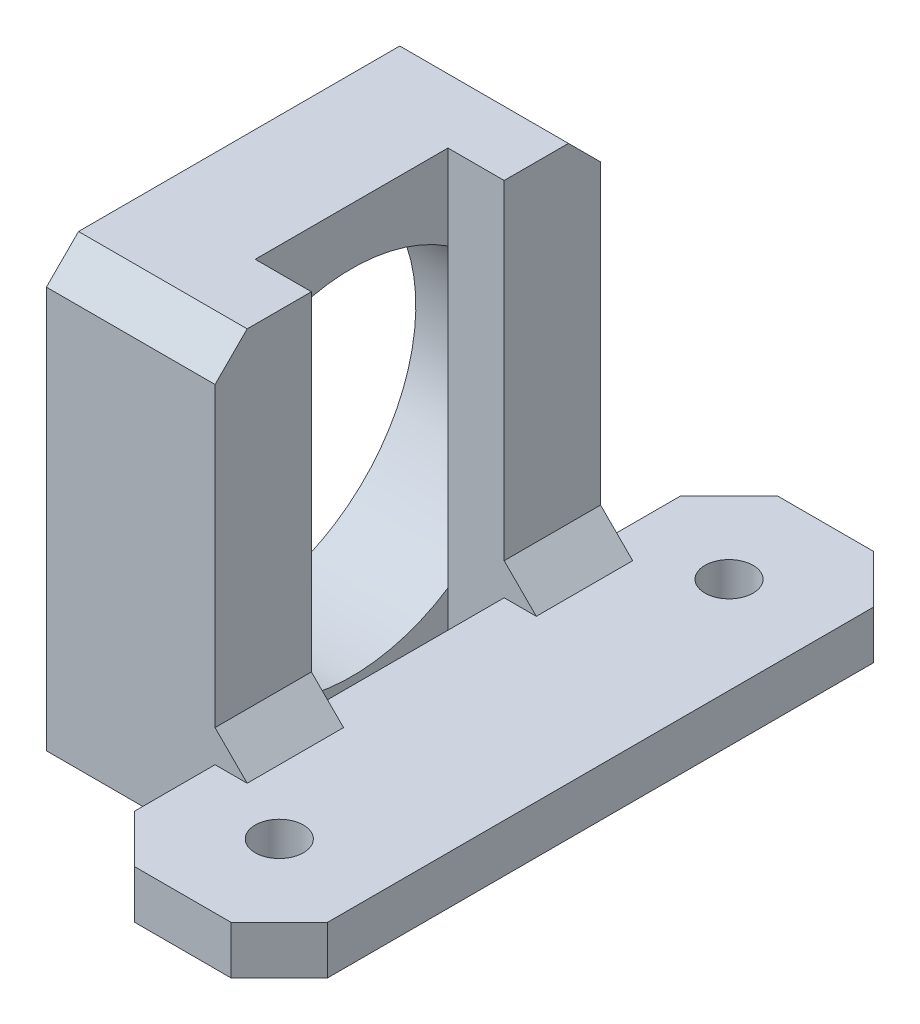
ISO-10303-21;
HEADER;
FILE_DESCRIPTION(('STEP AP214'),'2;1');
FILE_NAME('part.step','',(''),(''),'','','');
FILE_SCHEMA(('AUTOMOTIVE_DESIGN { 1 0 10303 214 1 1 1 1 }'));
ENDSEC;
DATA;
#1=APPLICATION_CONTEXT('core data for automotive mechanical design processes');
#2=APPLICATION_PROTOCOL_DEFINITION('international standard','automotive_design',2000,#1);
#3=PRODUCT_CONTEXT('',#1,'mechanical');
#4=PRODUCT('Part','Part','',(#3));
#5=PRODUCT_RELATED_PRODUCT_CATEGORY('part','',(#4));
#6=PRODUCT_DEFINITION_FORMATION('','',#4);
#7=PRODUCT_DEFINITION_CONTEXT('part definition',#1,'design');
#8=PRODUCT_DEFINITION('design','',#6,#7);
#9=PRODUCT_DEFINITION_SHAPE('','',#8);
#10=(LENGTH_UNIT() NAMED_UNIT(*) SI_UNIT(.MILLI.,.METRE.));
#11=(NAMED_UNIT(*) PLANE_ANGLE_UNIT() SI_UNIT($,.RADIAN.));
#12=(NAMED_UNIT(*) SI_UNIT($,.STERADIAN.) SOLID_ANGLE_UNIT());
#13=UNCERTAINTY_MEASURE_WITH_UNIT(LENGTH_MEASURE(1.E-05),#10,'distance_accuracy_value','');
#14=(GEOMETRIC_REPRESENTATION_CONTEXT(3) GLOBAL_UNCERTAINTY_ASSIGNED_CONTEXT((#13)) GLOBAL_UNIT_ASSIGNED_CONTEXT((#10,
#11,#12)) REPRESENTATION_CONTEXT('',''));
#15=CARTESIAN_POINT('',(0.,0.,0.));
#16=DIRECTION('',(0.,0.,1.));
#17=DIRECTION('',(1.,0.,0.));
#18=AXIS2_PLACEMENT_3D('',#15,#16,#17);
#19=CARTESIAN_POINT('',(-9.5,-3.5,6.));
#20=DIRECTION('',(-1.,0.,0.));
#21=DIRECTION('',(0.,0.,1.));
#22=AXIS2_PLACEMENT_3D('',#19,#20,#21);
#23=PLANE('',#22);
#24=DIRECTION('',(0.,1.,0.));
#25=VECTOR('',#24,1.);
#26=CARTESIAN_POINT('',(-9.5,-3.5,6.));
#27=LINE('',#26,#25);
#28=CARTESIAN_POINT('',(-9.5,1.78045554270711,6.));
#29=VERTEX_POINT('',#28);
#30=CARTESIAN_POINT('',(-9.5,20.2195444572929,6.));
#31=VERTEX_POINT('',#30);
#32=EDGE_CURVE('E340',#29,#31,#27,.T.);
#33=ORIENTED_EDGE('',*,*,#32,.F.);
#34=CARTESIAN_POINT('',(-9.5,11.,0.));
#35=DIRECTION('',(-1.,0.,0.));
#36=DIRECTION('',(0.,0.,1.));
#37=AXIS2_PLACEMENT_3D('',#34,#35,#36);
#38=CIRCLE('',#37,11.);
#39=EDGE_CURVE('E610',#29,#31,#38,.T.);
#40=ORIENTED_EDGE('',*,*,#39,.T.);
#41=EDGE_LOOP('',(#33,#40));
#42=FACE_BOUND('',#41,.T.);
#43=ADVANCED_FACE('F97',(#42),#23,.T.);
#44=CARTESIAN_POINT('',(-9.5,-3.5,-12.));
#45=DIRECTION('',(-1.,0.,0.));
#46=DIRECTION('',(0.,0.,1.));
#47=AXIS2_PLACEMENT_3D('',#44,#45,#46);
#48=PLANE('',#47);
#49=DIRECTION('',(0.,1.,0.));
#50=VECTOR('',#49,1.);
#51=CARTESIAN_POINT('',(-9.5,-3.5,-6.));
#52=LINE('',#51,#50);
#53=CARTESIAN_POINT('',(-9.5,1.78045554270711,-5.99999999999999));
#54=VERTEX_POINT('',#53);
#55=CARTESIAN_POINT('',(-9.5,20.2195444572929,-6.));
#56=VERTEX_POINT('',#55);
#57=EDGE_CURVE('E577',#54,#56,#52,.T.);
#58=ORIENTED_EDGE('',*,*,#57,.T.);
#59=EDGE_CURVE('E501',#56,#54,#38,.T.);
#60=ORIENTED_EDGE('',*,*,#59,.T.);
#61=EDGE_LOOP('',(#58,#60));
#62=FACE_BOUND('',#61,.T.);
#63=ADVANCED_FACE('F604',(#62),#48,.T.);
#64=CARTESIAN_POINT('',(-6.,3.,-17.));
#65=DIRECTION('',(1.,0.,0.));
#66=DIRECTION('',(0.,0.,-1.));
#67=AXIS2_PLACEMENT_3D('',#64,#65,#66);
#68=PLANE('',#67);
#69=DIRECTION('',(0.,1.,0.));
#70=VECTOR('',#69,1.);
#71=CARTESIAN_POINT('',(-6.,-3.5,-6.));
#72=LINE('',#71,#70);
#73=CARTESIAN_POINT('',(-6.,0.,-6.));
#74=VERTEX_POINT('',#73);
#75=CARTESIAN_POINT('',(-6.,3.,-6.));
#76=VERTEX_POINT('',#75);
#77=EDGE_CURVE('E445',#74,#76,#72,.T.);
#78=ORIENTED_EDGE('',*,*,#77,.F.);
#79=DIRECTION('',(0.,0.,1.));
#80=VECTOR('',#79,1.);
#81=CARTESIAN_POINT('',(-6.,0.,-17.));
#82=LINE('',#81,#80);
#83=CARTESIAN_POINT('',(-6.,0.,6.));
#84=VERTEX_POINT('',#83);
#85=EDGE_CURVE('E422',#74,#84,#82,.T.);
#86=ORIENTED_EDGE('',*,*,#85,.T.);
#87=DIRECTION('',(0.,1.,0.));
#88=VECTOR('',#87,1.);
#89=CARTESIAN_POINT('',(-6.,-3.5,6.));
#90=LINE('',#89,#88);
#91=CARTESIAN_POINT('',(-6.,3.,6.));
#92=VERTEX_POINT('',#91);
#93=EDGE_CURVE('E425',#84,#92,#90,.T.);
#94=ORIENTED_EDGE('',*,*,#93,.T.);
#95=DIRECTION('',(0.,0.,1.));
#96=VECTOR('',#95,1.);
#97=CARTESIAN_POINT('',(-6.,3.,-17.));
#98=LINE('',#97,#96);
#99=EDGE_CURVE('E400',#76,#92,#98,.T.);
#100=ORIENTED_EDGE('',*,*,#99,.F.);
#101=EDGE_LOOP('',(#78,#86,#94,#100));
#102=FACE_BOUND('',#101,.T.);
#103=ADVANCED_FACE('F663',(#102),#68,.F.);
#104=DIRECTION('',(0.,1.,0.));
#105=VECTOR('',#104,1.);
#106=CARTESIAN_POINT('',(-6.,-3.5,12.));
#107=LINE('',#106,#105);
#108=CARTESIAN_POINT('',(-6.,0.,12.));
#109=VERTEX_POINT('',#108);
#110=CARTESIAN_POINT('',(-6.,3.,12.));
#111=VERTEX_POINT('',#110);
#112=EDGE_CURVE('E549',#109,#111,#107,.T.);
#113=ORIENTED_EDGE('',*,*,#112,.F.);
#114=CARTESIAN_POINT('',(-6.,0.,17.));
#115=VERTEX_POINT('',#114);
#116=EDGE_CURVE('E419',#109,#115,#82,.T.);
#117=ORIENTED_EDGE('',*,*,#116,.T.);
#118=DIRECTION('',(0.,-1.,0.));
#119=VECTOR('',#118,1.);
#120=CARTESIAN_POINT('',(-6.,3.,17.));
#121=LINE('',#120,#119);
#122=CARTESIAN_POINT('',(-6.,3.,17.));
#123=VERTEX_POINT('',#122);
#124=EDGE_CURVE('E426',#123,#115,#121,.T.);
#125=ORIENTED_EDGE('',*,*,#124,.F.);
#126=EDGE_CURVE('E395',#111,#123,#98,.T.);
#127=ORIENTED_EDGE('',*,*,#126,.F.);
#128=EDGE_LOOP('',(#113,#117,#125,#127));
#129=FACE_BOUND('',#128,.T.);
#130=ADVANCED_FACE('F649',(#129),#68,.F.);
#131=CARTESIAN_POINT('',(0.,3.,0.));
#132=DIRECTION('',(0.,-1.,0.));
#133=DIRECTION('',(0.,0.,-1.));
#134=AXIS2_PLACEMENT_3D('',#131,#132,#133);
#135=PLANE('',#134);
#136=DIRECTION('',(0.,0.,1.));
#137=VECTOR('',#136,1.);
#138=CARTESIAN_POINT('',(-4.00000000000001,3.,-6.));
#139=LINE('',#138,#137);
#140=CARTESIAN_POINT('',(-4.00000000000002,3.,-12.));
#141=VERTEX_POINT('',#140);
#142=CARTESIAN_POINT('',(-4.00000000000001,3.,-6.));
#143=VERTEX_POINT('',#142);
#144=EDGE_CURVE('E475',#141,#143,#139,.T.);
#145=ORIENTED_EDGE('',*,*,#144,.T.);
#146=DIRECTION('',(-1.,0.,0.));
#147=VECTOR('',#146,1.);
#148=CARTESIAN_POINT('',(0.,3.,-6.));
#149=LINE('',#148,#147);
#150=EDGE_CURVE('E478',#143,#76,#149,.T.);
#151=ORIENTED_EDGE('',*,*,#150,.T.);
#152=ORIENTED_EDGE('',*,*,#99,.T.);
#153=DIRECTION('',(1.,0.,0.));
#154=VECTOR('',#153,1.);
#155=CARTESIAN_POINT('',(-9.5,3.,6.));
#156=LINE('',#155,#154);
#157=CARTESIAN_POINT('',(-4.00000000000001,3.,6.));
#158=VERTEX_POINT('',#157);
#159=EDGE_CURVE('E464',#92,#158,#156,.T.);
#160=ORIENTED_EDGE('',*,*,#159,.T.);
#161=DIRECTION('',(0.,0.,1.));
#162=VECTOR('',#161,1.);
#163=CARTESIAN_POINT('',(-4.00000000000001,3.,12.));
#164=LINE('',#163,#162);
#165=CARTESIAN_POINT('',(-4.00000000000001,3.,12.));
#166=VERTEX_POINT('',#165);
#167=EDGE_CURVE('E467',#158,#166,#164,.T.);
#168=ORIENTED_EDGE('',*,*,#167,.T.);
#169=DIRECTION('',(-1.,0.,0.));
#170=VECTOR('',#169,1.);
#171=CARTESIAN_POINT('',(0.,3.,12.));
#172=LINE('',#171,#170);
#173=EDGE_CURVE('E470',#166,#111,#172,.T.);
#174=ORIENTED_EDGE('',*,*,#173,.T.);
#175=ORIENTED_EDGE('',*,*,#126,.T.);
#176=DIRECTION('',(0.707106781186548,0.,0.707106781186547));
#177=VECTOR('',#176,1.);
#178=CARTESIAN_POINT('',(-6.,3.,17.));
#179=LINE('',#178,#177);
#180=CARTESIAN_POINT('',(-2.99999999999999,3.,20.));
#181=VERTEX_POINT('',#180);
#182=EDGE_CURVE('E393',#123,#181,#179,.T.);
#183=ORIENTED_EDGE('',*,*,#182,.T.);
#184=DIRECTION('',(1.,0.,0.));
#185=VECTOR('',#184,1.);
#186=CARTESIAN_POINT('',(-2.99999999999999,3.,20.));
#187=LINE('',#186,#185);
#188=CARTESIAN_POINT('',(3.00000000000001,3.,20.));
#189=VERTEX_POINT('',#188);
#190=EDGE_CURVE('E391',#181,#189,#187,.T.);
#191=ORIENTED_EDGE('',*,*,#190,.T.);
#192=DIRECTION('',(0.707106781186548,0.,-0.707106781186548));
#193=VECTOR('',#192,1.);
#194=CARTESIAN_POINT('',(3.00000000000001,3.,20.));
#195=LINE('',#194,#193);
#196=CARTESIAN_POINT('',(6.,3.,17.));
#197=VERTEX_POINT('',#196);
#198=EDGE_CURVE('E389',#189,#197,#195,.T.);
#199=ORIENTED_EDGE('',*,*,#198,.T.);
#200=DIRECTION('',(0.,0.,1.));
#201=VECTOR('',#200,1.);
#202=CARTESIAN_POINT('',(6.,3.,-17.));
#203=LINE('',#202,#201);
#204=CARTESIAN_POINT('',(6.,3.,-17.));
#205=VERTEX_POINT('',#204);
#206=EDGE_CURVE('E386',#205,#197,#203,.T.);
#207=ORIENTED_EDGE('',*,*,#206,.F.);
#208=DIRECTION('',(0.707106781186548,0.,0.707106781186547));
#209=VECTOR('',#208,1.);
#210=CARTESIAN_POINT('',(3.,3.,-20.));
#211=LINE('',#210,#209);
#212=CARTESIAN_POINT('',(3.,3.,-20.));
#213=VERTEX_POINT('',#212);
#214=EDGE_CURVE('E383',#213,#205,#211,.T.);
#215=ORIENTED_EDGE('',*,*,#214,.F.);
#216=DIRECTION('',(1.,0.,0.));
#217=VECTOR('',#216,1.);
#218=CARTESIAN_POINT('',(-3.,3.,-20.));
#219=LINE('',#218,#217);
#220=CARTESIAN_POINT('',(-3.,3.,-20.));
#221=VERTEX_POINT('',#220);
#222=EDGE_CURVE('E379',#221,#213,#219,.T.);
#223=ORIENTED_EDGE('',*,*,#222,.F.);
#224=DIRECTION('',(0.707106781186548,0.,-0.707106781186548));
#225=VECTOR('',#224,1.);
#226=CARTESIAN_POINT('',(-6.,3.,-17.));
#227=LINE('',#226,#225);
#228=CARTESIAN_POINT('',(-6.,3.,-17.));
#229=VERTEX_POINT('',#228);
#230=EDGE_CURVE('E376',#229,#221,#227,.T.);
#231=ORIENTED_EDGE('',*,*,#230,.F.);
#232=CARTESIAN_POINT('',(-6.,3.,-12.));
#233=VERTEX_POINT('',#232);
#234=EDGE_CURVE('E396',#229,#233,#98,.T.);
#235=ORIENTED_EDGE('',*,*,#234,.T.);
#236=DIRECTION('',(1.,0.,0.));
#237=VECTOR('',#236,1.);
#238=CARTESIAN_POINT('',(-9.5,3.,-12.));
#239=LINE('',#238,#237);
#240=EDGE_CURVE('E472',#233,#141,#239,.T.);
#241=ORIENTED_EDGE('',*,*,#240,.T.);
#242=EDGE_LOOP('',(#145,#151,#152,#160,#168,#174,#175,#183,#191,#199,#207,#215,#223,#231,#235,#241));
#243=FACE_BOUND('',#242,.T.);
#244=CARTESIAN_POINT('',(0.,3.,-14.));
#245=DIRECTION('',(0.,1.,0.));
#246=DIRECTION('',(0.,0.,1.));
#247=AXIS2_PLACEMENT_3D('',#244,#245,#246);
#248=CIRCLE('',#247,1.5);
#249=CARTESIAN_POINT('',(0.,3.,-12.5));
#250=VERTEX_POINT('',#249);
#251=EDGE_CURVE('E370',#250,#250,#248,.T.);
#252=ORIENTED_EDGE('',*,*,#251,.F.);
#253=EDGE_LOOP('',(#252));
#254=FACE_BOUND('',#253,.T.);
#255=CARTESIAN_POINT('',(0.,3.,14.));
#256=DIRECTION('',(0.,1.,0.));
#257=DIRECTION('',(0.,0.,1.));
#258=AXIS2_PLACEMENT_3D('',#255,#256,#257);
#259=CIRCLE('',#258,1.5);
#260=CARTESIAN_POINT('',(0.,3.,15.5));
#261=VERTEX_POINT('',#260);
#262=EDGE_CURVE('E362',#261,#261,#259,.T.);
#263=ORIENTED_EDGE('',*,*,#262,.F.);
#264=EDGE_LOOP('',(#263));
#265=FACE_BOUND('',#264,.T.);
#266=ADVANCED_FACE('F655',(#243,#254,#265),#135,.F.);
#267=CARTESIAN_POINT('',(0.,0.,0.));
#268=DIRECTION('',(0.,-1.,0.));
#269=DIRECTION('',(0.,0.,-1.));
#270=AXIS2_PLACEMENT_3D('',#267,#268,#269);
#271=PLANE('',#270);
#272=CARTESIAN_POINT('',(0.,0.,-14.));
#273=DIRECTION('',(0.,1.,0.));
#274=DIRECTION('',(0.,0.,1.));
#275=AXIS2_PLACEMENT_3D('',#272,#273,#274);
#276=CIRCLE('',#275,1.5);
#277=CARTESIAN_POINT('',(0.,0.,-12.5));
#278=VERTEX_POINT('',#277);
#279=EDGE_CURVE('E365',#278,#278,#276,.T.);
#280=ORIENTED_EDGE('',*,*,#279,.T.);
#281=EDGE_LOOP('',(#280));
#282=FACE_BOUND('',#281,.T.);
#283=ORIENTED_EDGE('',*,*,#85,.F.);
#284=DIRECTION('',(1.,0.,0.));
#285=VECTOR('',#284,1.);
#286=CARTESIAN_POINT('',(-9.5,0.,-6.));
#287=LINE('',#286,#285);
#288=CARTESIAN_POINT('',(-4.00000000000001,0.,-6.));
#289=VERTEX_POINT('',#288);
#290=EDGE_CURVE('E458',#74,#289,#287,.T.);
#291=ORIENTED_EDGE('',*,*,#290,.T.);
#292=DIRECTION('',(0.,0.,-1.));
#293=VECTOR('',#292,1.);
#294=CARTESIAN_POINT('',(-4.00000000000001,0.,0.));
#295=LINE('',#294,#293);
#296=CARTESIAN_POINT('',(-4.00000000000002,0.,-12.));
#297=VERTEX_POINT('',#296);
#298=EDGE_CURVE('E455',#289,#297,#295,.T.);
#299=ORIENTED_EDGE('',*,*,#298,.T.);
#300=DIRECTION('',(-1.,0.,0.));
#301=VECTOR('',#300,1.);
#302=CARTESIAN_POINT('',(0.,0.,-12.));
#303=LINE('',#302,#301);
#304=CARTESIAN_POINT('',(-6.,0.,-12.));
#305=VERTEX_POINT('',#304);
#306=EDGE_CURVE('E453',#297,#305,#303,.T.);
#307=ORIENTED_EDGE('',*,*,#306,.T.);
#308=CARTESIAN_POINT('',(-6.,0.,-17.));
#309=VERTEX_POINT('',#308);
#310=EDGE_CURVE('E380',#309,#305,#82,.T.);
#311=ORIENTED_EDGE('',*,*,#310,.F.);
#312=DIRECTION('',(0.707106781186548,0.,-0.707106781186548));
#313=VECTOR('',#312,1.);
#314=CARTESIAN_POINT('',(-6.,0.,-17.));
#315=LINE('',#314,#313);
#316=CARTESIAN_POINT('',(-3.,0.,-20.));
#317=VERTEX_POINT('',#316);
#318=EDGE_CURVE('E373',#309,#317,#315,.T.);
#319=ORIENTED_EDGE('',*,*,#318,.T.);
#320=DIRECTION('',(1.,0.,0.));
#321=VECTOR('',#320,1.);
#322=CARTESIAN_POINT('',(-3.,0.,-20.));
#323=LINE('',#322,#321);
#324=CARTESIAN_POINT('',(3.,0.,-20.));
#325=VERTEX_POINT('',#324);
#326=EDGE_CURVE('E403',#317,#325,#323,.T.);
#327=ORIENTED_EDGE('',*,*,#326,.T.);
#328=DIRECTION('',(0.707106781186548,0.,0.707106781186547));
#329=VECTOR('',#328,1.);
#330=CARTESIAN_POINT('',(3.,0.,-20.));
#331=LINE('',#330,#329);
#332=CARTESIAN_POINT('',(6.,0.,-17.));
#333=VERTEX_POINT('',#332);
#334=EDGE_CURVE('E406',#325,#333,#331,.T.);
#335=ORIENTED_EDGE('',*,*,#334,.T.);
#336=DIRECTION('',(0.,0.,1.));
#337=VECTOR('',#336,1.);
#338=CARTESIAN_POINT('',(6.,0.,-17.));
#339=LINE('',#338,#337);
#340=CARTESIAN_POINT('',(6.,0.,17.));
#341=VERTEX_POINT('',#340);
#342=EDGE_CURVE('E409',#333,#341,#339,.T.);
#343=ORIENTED_EDGE('',*,*,#342,.T.);
#344=DIRECTION('',(0.707106781186548,0.,-0.707106781186548));
#345=VECTOR('',#344,1.);
#346=CARTESIAN_POINT('',(3.00000000000001,0.,20.));
#347=LINE('',#346,#345);
#348=CARTESIAN_POINT('',(3.00000000000001,0.,20.));
#349=VERTEX_POINT('',#348);
#350=EDGE_CURVE('E412',#349,#341,#347,.T.);
#351=ORIENTED_EDGE('',*,*,#350,.F.);
#352=DIRECTION('',(1.,0.,0.));
#353=VECTOR('',#352,1.);
#354=CARTESIAN_POINT('',(-2.99999999999999,0.,20.));
#355=LINE('',#354,#353);
#356=CARTESIAN_POINT('',(-2.99999999999999,0.,20.));
#357=VERTEX_POINT('',#356);
#358=EDGE_CURVE('E415',#357,#349,#355,.T.);
#359=ORIENTED_EDGE('',*,*,#358,.F.);
#360=DIRECTION('',(0.707106781186548,0.,0.707106781186547));
#361=VECTOR('',#360,1.);
#362=CARTESIAN_POINT('',(-6.,0.,17.));
#363=LINE('',#362,#361);
#364=EDGE_CURVE('E417',#115,#357,#363,.T.);
#365=ORIENTED_EDGE('',*,*,#364,.F.);
#366=ORIENTED_EDGE('',*,*,#116,.F.);
#367=DIRECTION('',(1.,0.,0.));
#368=VECTOR('',#367,1.);
#369=CARTESIAN_POINT('',(-9.5,0.,12.));
#370=LINE('',#369,#368);
#371=CARTESIAN_POINT('',(-4.00000000000001,0.,12.));
#372=VERTEX_POINT('',#371);
#373=EDGE_CURVE('E450',#109,#372,#370,.T.);
#374=ORIENTED_EDGE('',*,*,#373,.T.);
#375=DIRECTION('',(0.,0.,-1.));
#376=VECTOR('',#375,1.);
#377=CARTESIAN_POINT('',(-4.00000000000001,0.,0.));
#378=LINE('',#377,#376);
#379=CARTESIAN_POINT('',(-4.00000000000001,0.,6.));
#380=VERTEX_POINT('',#379);
#381=EDGE_CURVE('E447',#372,#380,#378,.T.);
#382=ORIENTED_EDGE('',*,*,#381,.T.);
#383=DIRECTION('',(-1.,0.,0.));
#384=VECTOR('',#383,1.);
#385=CARTESIAN_POINT('',(0.,0.,6.00000000000001));
#386=LINE('',#385,#384);
#387=EDGE_CURVE('E444',#380,#84,#386,.T.);
#388=ORIENTED_EDGE('',*,*,#387,.T.);
#389=EDGE_LOOP('',(#283,#291,#299,#307,#311,#319,#327,#335,#343,#351,#359,#365,#366,#374,#382,#388));
#390=FACE_BOUND('',#389,.T.);
#391=CARTESIAN_POINT('',(0.,0.,14.));
#392=DIRECTION('',(0.,1.,0.));
#393=DIRECTION('',(0.,0.,1.));
#394=AXIS2_PLACEMENT_3D('',#391,#392,#393);
#395=CIRCLE('',#394,1.5);
#396=CARTESIAN_POINT('',(0.,0.,15.5));
#397=VERTEX_POINT('',#396);
#398=EDGE_CURVE('E366',#397,#397,#395,.T.);
#399=ORIENTED_EDGE('',*,*,#398,.T.);
#400=EDGE_LOOP('',(#399));
#401=FACE_BOUND('',#400,.T.);
#402=ADVANCED_FACE('F639',(#282,#390,#401),#271,.T.);
#403=CARTESIAN_POINT('',(-6.,3.,-17.));
#404=DIRECTION('',(-0.707106781186547,0.,-0.707106781186547));
#405=DIRECTION('',(-0.707106781186548,0.,0.707106781186548));
#406=AXIS2_PLACEMENT_3D('',#403,#404,#405);
#407=PLANE('',#406);
#408=ORIENTED_EDGE('',*,*,#318,.F.);
#409=DIRECTION('',(0.,-1.,0.));
#410=VECTOR('',#409,1.);
#411=CARTESIAN_POINT('',(-6.,3.,-17.));
#412=LINE('',#411,#410);
#413=EDGE_CURVE('E423',#229,#309,#412,.T.);
#414=ORIENTED_EDGE('',*,*,#413,.F.);
#415=ORIENTED_EDGE('',*,*,#230,.T.);
#416=DIRECTION('',(0.,-1.,0.));
#417=VECTOR('',#416,1.);
#418=CARTESIAN_POINT('',(-3.,3.,-20.));
#419=LINE('',#418,#417);
#420=EDGE_CURVE('E399',#221,#317,#419,.T.);
#421=ORIENTED_EDGE('',*,*,#420,.T.);
#422=EDGE_LOOP('',(#408,#414,#415,#421));
#423=FACE_BOUND('',#422,.T.);
#424=ADVANCED_FACE('F702',(#423),#407,.T.);
#425=ORIENTED_EDGE('',*,*,#310,.T.);
#426=DIRECTION('',(0.,1.,0.));
#427=VECTOR('',#426,1.);
#428=CARTESIAN_POINT('',(-6.,-3.5,-12.));
#429=LINE('',#428,#427);
#430=EDGE_CURVE('E581',#305,#233,#429,.T.);
#431=ORIENTED_EDGE('',*,*,#430,.T.);
#432=ORIENTED_EDGE('',*,*,#234,.F.);
#433=ORIENTED_EDGE('',*,*,#413,.T.);
#434=EDGE_LOOP('',(#425,#431,#432,#433));
#435=FACE_BOUND('',#434,.T.);
#436=ADVANCED_FACE('F704',(#435),#68,.F.);
#437=CARTESIAN_POINT('',(-6.,3.,17.));
#438=DIRECTION('',(0.707106781186547,0.,-0.707106781186548));
#439=DIRECTION('',(-0.707106781186548,0.,-0.707106781186547));
#440=AXIS2_PLACEMENT_3D('',#437,#438,#439);
#441=PLANE('',#440);
#442=ORIENTED_EDGE('',*,*,#364,.T.);
#443=DIRECTION('',(0.,-1.,0.));
#444=VECTOR('',#443,1.);
#445=CARTESIAN_POINT('',(-2.99999999999999,3.,20.));
#446=LINE('',#445,#444);
#447=EDGE_CURVE('E429',#181,#357,#446,.T.);
#448=ORIENTED_EDGE('',*,*,#447,.F.);
#449=ORIENTED_EDGE('',*,*,#182,.F.);
#450=ORIENTED_EDGE('',*,*,#124,.T.);
#451=EDGE_LOOP('',(#442,#448,#449,#450));
#452=FACE_BOUND('',#451,.T.);
#453=ADVANCED_FACE('F707',(#452),#441,.F.);
#454=CARTESIAN_POINT('',(-2.99999999999999,3.,20.));
#455=DIRECTION('',(0.,0.,-1.));
#456=DIRECTION('',(-1.,0.,0.));
#457=AXIS2_PLACEMENT_3D('',#454,#455,#456);
#458=PLANE('',#457);
#459=ORIENTED_EDGE('',*,*,#358,.T.);
#460=DIRECTION('',(0.,-1.,0.));
#461=VECTOR('',#460,1.);
#462=CARTESIAN_POINT('',(3.00000000000001,3.,20.));
#463=LINE('',#462,#461);
#464=EDGE_CURVE('E432',#189,#349,#463,.T.);
#465=ORIENTED_EDGE('',*,*,#464,.F.);
#466=ORIENTED_EDGE('',*,*,#190,.F.);
#467=ORIENTED_EDGE('',*,*,#447,.T.);
#468=EDGE_LOOP('',(#459,#465,#466,#467));
#469=FACE_BOUND('',#468,.T.);
#470=ADVANCED_FACE('F711',(#469),#458,.F.);
#471=CARTESIAN_POINT('',(3.00000000000001,3.,20.));
#472=DIRECTION('',(-0.707106781186547,0.,-0.707106781186547));
#473=DIRECTION('',(-0.707106781186548,0.,0.707106781186548));
#474=AXIS2_PLACEMENT_3D('',#471,#472,#473);
#475=PLANE('',#474);
#476=ORIENTED_EDGE('',*,*,#350,.T.);
#477=DIRECTION('',(0.,-1.,0.));
#478=VECTOR('',#477,1.);
#479=CARTESIAN_POINT('',(6.,3.,17.));
#480=LINE('',#479,#478);
#481=EDGE_CURVE('E435',#197,#341,#480,.T.);
#482=ORIENTED_EDGE('',*,*,#481,.F.);
#483=ORIENTED_EDGE('',*,*,#198,.F.);
#484=ORIENTED_EDGE('',*,*,#464,.T.);
#485=EDGE_LOOP('',(#476,#482,#483,#484));
#486=FACE_BOUND('',#485,.T.);
#487=ADVANCED_FACE('F715',(#486),#475,.F.);
#488=CARTESIAN_POINT('',(6.,3.,-17.));
#489=DIRECTION('',(1.,0.,0.));
#490=DIRECTION('',(0.,0.,-1.));
#491=AXIS2_PLACEMENT_3D('',#488,#489,#490);
#492=PLANE('',#491);
#493=ORIENTED_EDGE('',*,*,#342,.F.);
#494=DIRECTION('',(0.,-1.,0.));
#495=VECTOR('',#494,1.);
#496=CARTESIAN_POINT('',(6.,3.,-17.));
#497=LINE('',#496,#495);
#498=EDGE_CURVE('E437',#205,#333,#497,.T.);
#499=ORIENTED_EDGE('',*,*,#498,.F.);
#500=ORIENTED_EDGE('',*,*,#206,.T.);
#501=ORIENTED_EDGE('',*,*,#481,.T.);
#502=EDGE_LOOP('',(#493,#499,#500,#501));
#503=FACE_BOUND('',#502,.T.);
#504=ADVANCED_FACE('F719',(#503),#492,.T.);
#505=CARTESIAN_POINT('',(3.,3.,-20.));
#506=DIRECTION('',(0.707106781186547,0.,-0.707106781186548));
#507=DIRECTION('',(-0.707106781186548,0.,-0.707106781186547));
#508=AXIS2_PLACEMENT_3D('',#505,#506,#507);
#509=PLANE('',#508);
#510=ORIENTED_EDGE('',*,*,#334,.F.);
#511=DIRECTION('',(0.,-1.,0.));
#512=VECTOR('',#511,1.);
#513=CARTESIAN_POINT('',(3.,3.,-20.));
#514=LINE('',#513,#512);
#515=EDGE_CURVE('E439',#213,#325,#514,.T.);
#516=ORIENTED_EDGE('',*,*,#515,.F.);
#517=ORIENTED_EDGE('',*,*,#214,.T.);
#518=ORIENTED_EDGE('',*,*,#498,.T.);
#519=EDGE_LOOP('',(#510,#516,#517,#518));
#520=FACE_BOUND('',#519,.T.);
#521=ADVANCED_FACE('F723',(#520),#509,.T.);
#522=CARTESIAN_POINT('',(-3.,3.,-20.));
#523=DIRECTION('',(0.,0.,-1.));
#524=DIRECTION('',(-1.,0.,0.));
#525=AXIS2_PLACEMENT_3D('',#522,#523,#524);
#526=PLANE('',#525);
#527=ORIENTED_EDGE('',*,*,#326,.F.);
#528=ORIENTED_EDGE('',*,*,#420,.F.);
#529=ORIENTED_EDGE('',*,*,#222,.T.);
#530=ORIENTED_EDGE('',*,*,#515,.T.);
#531=EDGE_LOOP('',(#527,#528,#529,#530));
#532=FACE_BOUND('',#531,.T.);
#533=ADVANCED_FACE('F696',(#532),#526,.T.);
#534=CARTESIAN_POINT('',(0.,3.,-14.));
#535=DIRECTION('',(0.,-1.,0.));
#536=DIRECTION('',(0.,0.,-1.));
#537=AXIS2_PLACEMENT_3D('',#534,#535,#536);
#538=CYLINDRICAL_SURFACE('',#537,1.5);
#539=ORIENTED_EDGE('',*,*,#251,.T.);
#540=EDGE_LOOP('',(#539));
#541=FACE_BOUND('',#540,.T.);
#542=ORIENTED_EDGE('',*,*,#279,.F.);
#543=EDGE_LOOP('',(#542));
#544=FACE_BOUND('',#543,.T.);
#545=ADVANCED_FACE('F692',(#541,#544),#538,.F.);
#546=CARTESIAN_POINT('',(0.,3.,14.));
#547=DIRECTION('',(0.,-1.,0.));
#548=DIRECTION('',(0.,0.,-1.));
#549=AXIS2_PLACEMENT_3D('',#546,#547,#548);
#550=CYLINDRICAL_SURFACE('',#549,1.5);
#551=ORIENTED_EDGE('',*,*,#262,.T.);
#552=EDGE_LOOP('',(#551));
#553=FACE_BOUND('',#552,.T.);
#554=ORIENTED_EDGE('',*,*,#398,.F.);
#555=EDGE_LOOP('',(#554));
#556=FACE_BOUND('',#555,.T.);
#557=ADVANCED_FACE('F688',(#553,#556),#550,.F.);
#558=CARTESIAN_POINT('',(-6.,-3.5,6.));
#559=DIRECTION('',(-1.,0.,0.));
#560=DIRECTION('',(0.,0.,1.));
#561=AXIS2_PLACEMENT_3D('',#558,#559,#560);
#562=PLANE('',#561);
#563=DIRECTION('',(0.,0.,1.));
#564=VECTOR('',#563,1.);
#565=CARTESIAN_POINT('',(-6.,-1.99999999999999,6.));
#566=LINE('',#565,#564);
#567=CARTESIAN_POINT('',(-6.,-2.,6.));
#568=VERTEX_POINT('',#567);
#569=CARTESIAN_POINT('',(-6.,-1.99999999999999,11.5));
#570=VERTEX_POINT('',#569);
#571=EDGE_CURVE('E461',#568,#570,#566,.T.);
#572=ORIENTED_EDGE('',*,*,#571,.T.);
#573=DIRECTION('',(0.,0.707106781186546,0.707106781186549));
#574=VECTOR('',#573,1.);
#575=CARTESIAN_POINT('',(-6.,-1.5,12.));
#576=LINE('',#575,#574);
#577=CARTESIAN_POINT('',(-6.,-3.5,9.99999999999999));
#578=VERTEX_POINT('',#577);
#579=EDGE_CURVE('E531',#570,#578,#576,.F.);
#580=ORIENTED_EDGE('',*,*,#579,.T.);
#581=DIRECTION('',(0.,0.,1.));
#582=VECTOR('',#581,1.);
#583=CARTESIAN_POINT('',(-6.,-3.5,6.));
#584=LINE('',#583,#582);
#585=CARTESIAN_POINT('',(-6.,-3.5,6.));
#586=VERTEX_POINT('',#585);
#587=EDGE_CURVE('E357',#586,#578,#584,.T.);
#588=ORIENTED_EDGE('',*,*,#587,.F.);
#589=EDGE_CURVE('E547',#586,#568,#90,.T.);
#590=ORIENTED_EDGE('',*,*,#589,.T.);
#591=EDGE_LOOP('',(#572,#580,#588,#590));
#592=FACE_BOUND('',#591,.T.);
#593=ADVANCED_FACE('F691',(#592),#562,.F.);
#594=CARTESIAN_POINT('',(-9.5,-3.5,6.));
#595=DIRECTION('',(0.,0.,1.));
#596=DIRECTION('',(1.,0.,0.));
#597=AXIS2_PLACEMENT_3D('',#594,#595,#596);
#598=PLANE('',#597);
#599=DIRECTION('',(1.,0.,0.));
#600=VECTOR('',#599,1.);
#601=CARTESIAN_POINT('',(-9.5,25.5,6.));
#602=LINE('',#601,#600);
#603=CARTESIAN_POINT('',(-9.5,25.5,6.));
#604=VERTEX_POINT('',#603);
#605=CARTESIAN_POINT('',(-6.,25.5,6.));
#606=VERTEX_POINT('',#605);
#607=EDGE_CURVE('E337',#604,#606,#602,.T.);
#608=ORIENTED_EDGE('',*,*,#607,.T.);
#609=CARTESIAN_POINT('',(-6.,4.99999999999998,6.));
#610=VERTEX_POINT('',#609);
#611=EDGE_CURVE('E341',#610,#606,#90,.T.);
#612=ORIENTED_EDGE('',*,*,#611,.F.);
#613=DIRECTION('',(-0.707106781186547,0.707106781186547,0.));
#614=VECTOR('',#613,1.);
#615=CARTESIAN_POINT('',(-3.50000000000001,2.49999999999999,6.));
#616=LINE('',#615,#614);
#617=EDGE_CURVE('E499',#610,#158,#616,.F.);
#618=ORIENTED_EDGE('',*,*,#617,.T.);
#619=ORIENTED_EDGE('',*,*,#159,.F.);
#620=ORIENTED_EDGE('',*,*,#93,.F.);
#621=ORIENTED_EDGE('',*,*,#387,.F.);
#622=DIRECTION('',(-0.707106781186547,-0.707106781186548,0.));
#623=VECTOR('',#622,1.);
#624=CARTESIAN_POINT('',(-8.5,-4.5,6.));
#625=LINE('',#624,#623);
#626=EDGE_CURVE('E491',#380,#568,#625,.T.);
#627=ORIENTED_EDGE('',*,*,#626,.T.);
#628=ORIENTED_EDGE('',*,*,#589,.F.);
#629=DIRECTION('',(1.,0.,0.));
#630=VECTOR('',#629,1.);
#631=CARTESIAN_POINT('',(-9.5,-3.5,6.));
#632=LINE('',#631,#630);
#633=CARTESIAN_POINT('',(-9.5,-3.5,6.));
#634=VERTEX_POINT('',#633);
#635=EDGE_CURVE('E354',#634,#586,#632,.T.);
#636=ORIENTED_EDGE('',*,*,#635,.F.);
#637=EDGE_CURVE('E344',#634,#29,#27,.T.);
#638=ORIENTED_EDGE('',*,*,#637,.T.);
#639=ORIENTED_EDGE('',*,*,#32,.T.);
#640=EDGE_CURVE('E321',#31,#604,#27,.T.);
#641=ORIENTED_EDGE('',*,*,#640,.T.);
#642=EDGE_LOOP('',(#608,#612,#618,#619,#620,#621,#627,#628,#636,#638,#639,#641));
#643=FACE_BOUND('',#642,.T.);
#644=ADVANCED_FACE('F335',(#643),#598,.F.);
#645=DIRECTION('',(0.,0.,1.));
#646=VECTOR('',#645,1.);
#647=CARTESIAN_POINT('',(-6.,25.5,6.));
#648=LINE('',#647,#646);
#649=CARTESIAN_POINT('',(-6.,25.5,10.));
#650=VERTEX_POINT('',#649);
#651=EDGE_CURVE('E349',#606,#650,#648,.T.);
#652=ORIENTED_EDGE('',*,*,#651,.T.);
#653=DIRECTION('',(0.,-0.707106781186549,0.707106781186546));
#654=VECTOR('',#653,1.);
#655=CARTESIAN_POINT('',(-6.,25.5,10.));
#656=LINE('',#655,#654);
#657=CARTESIAN_POINT('',(-6.,23.5,12.));
#658=VERTEX_POINT('',#657);
#659=EDGE_CURVE('E106',#650,#658,#656,.T.);
#660=ORIENTED_EDGE('',*,*,#659,.T.);
#661=CARTESIAN_POINT('',(-6.,4.99999999999998,12.));
#662=VERTEX_POINT('',#661);
#663=EDGE_CURVE('E540',#662,#658,#107,.T.);
#664=ORIENTED_EDGE('',*,*,#663,.F.);
#665=DIRECTION('',(0.,0.,-1.));
#666=VECTOR('',#665,1.);
#667=CARTESIAN_POINT('',(-6.,4.99999999999999,6.));
#668=LINE('',#667,#666);
#669=EDGE_CURVE('E482',#662,#610,#668,.T.);
#670=ORIENTED_EDGE('',*,*,#669,.T.);
#671=ORIENTED_EDGE('',*,*,#611,.T.);
#672=EDGE_LOOP('',(#652,#660,#664,#670,#671));
#673=FACE_BOUND('',#672,.T.);
#674=ADVANCED_FACE('F539',(#673),#562,.F.);
#675=CARTESIAN_POINT('',(-9.5,-3.5,12.));
#676=DIRECTION('',(0.,0.,1.));
#677=DIRECTION('',(1.,0.,0.));
#678=AXIS2_PLACEMENT_3D('',#675,#676,#677);
#679=PLANE('',#678);
#680=DIRECTION('',(0.,1.,0.));
#681=VECTOR('',#680,1.);
#682=CARTESIAN_POINT('',(-16.5,25.5,12.));
#683=LINE('',#682,#681);
#684=CARTESIAN_POINT('',(-16.5,-1.49999999999999,12.));
#685=VERTEX_POINT('',#684);
#686=CARTESIAN_POINT('',(-16.5,23.5,12.));
#687=VERTEX_POINT('',#686);
#688=EDGE_CURVE('E558',#685,#687,#683,.T.);
#689=ORIENTED_EDGE('',*,*,#688,.F.);
#690=DIRECTION('',(1.,0.,0.));
#691=VECTOR('',#690,1.);
#692=CARTESIAN_POINT('',(-9.5,-1.5,12.));
#693=LINE('',#692,#691);
#694=CARTESIAN_POINT('',(-5.50000000000001,-1.5,12.));
#695=VERTEX_POINT('',#694);
#696=EDGE_CURVE('E526',#685,#695,#693,.T.);
#697=ORIENTED_EDGE('',*,*,#696,.T.);
#698=DIRECTION('',(0.707106781186547,0.707106781186548,0.));
#699=VECTOR('',#698,1.);
#700=CARTESIAN_POINT('',(-6.,-2.,12.));
#701=LINE('',#700,#699);
#702=EDGE_CURVE('E489',#695,#372,#701,.T.);
#703=ORIENTED_EDGE('',*,*,#702,.T.);
#704=ORIENTED_EDGE('',*,*,#373,.F.);
#705=ORIENTED_EDGE('',*,*,#112,.T.);
#706=ORIENTED_EDGE('',*,*,#173,.F.);
#707=DIRECTION('',(0.707106781186548,-0.707106781186548,0.));
#708=VECTOR('',#707,1.);
#709=CARTESIAN_POINT('',(-4.00000000000001,3.,12.));
#710=LINE('',#709,#708);
#711=EDGE_CURVE('E497',#166,#662,#710,.F.);
#712=ORIENTED_EDGE('',*,*,#711,.T.);
#713=ORIENTED_EDGE('',*,*,#663,.T.);
#714=DIRECTION('',(-1.,0.,0.));
#715=VECTOR('',#714,1.);
#716=CARTESIAN_POINT('',(-16.5,23.5,12.));
#717=LINE('',#716,#715);
#718=EDGE_CURVE('E524',#658,#687,#717,.T.);
#719=ORIENTED_EDGE('',*,*,#718,.T.);
#720=EDGE_LOOP('',(#689,#697,#703,#704,#705,#706,#712,#713,#719));
#721=FACE_BOUND('',#720,.T.);
#722=ADVANCED_FACE('F544',(#721),#679,.T.);
#723=CARTESIAN_POINT('',(-6.,-3.5,-12.));
#724=DIRECTION('',(-1.,0.,0.));
#725=DIRECTION('',(0.,0.,1.));
#726=AXIS2_PLACEMENT_3D('',#723,#724,#725);
#727=PLANE('',#726);
#728=DIRECTION('',(0.,0.,1.));
#729=VECTOR('',#728,1.);
#730=CARTESIAN_POINT('',(-6.,-3.5,-12.));
#731=LINE('',#730,#729);
#732=CARTESIAN_POINT('',(-6.,-3.5,-10.));
#733=VERTEX_POINT('',#732);
#734=CARTESIAN_POINT('',(-6.,-3.5,-6.));
#735=VERTEX_POINT('',#734);
#736=EDGE_CURVE('E571',#733,#735,#731,.T.);
#737=ORIENTED_EDGE('',*,*,#736,.F.);
#738=DIRECTION('',(0.,0.707106781186549,-0.707106781186546));
#739=VECTOR('',#738,1.);
#740=CARTESIAN_POINT('',(-6.,-3.50000000000001,-9.99999999999999));
#741=LINE('',#740,#739);
#742=CARTESIAN_POINT('',(-6.,-1.99999999999999,-11.5));
#743=VERTEX_POINT('',#742);
#744=EDGE_CURVE('E507',#733,#743,#741,.T.);
#745=ORIENTED_EDGE('',*,*,#744,.T.);
#746=DIRECTION('',(0.,0.,1.));
#747=VECTOR('',#746,1.);
#748=CARTESIAN_POINT('',(-6.,-1.99999999999999,-12.));
#749=LINE('',#748,#747);
#750=CARTESIAN_POINT('',(-6.,-1.99999999999999,-6.));
#751=VERTEX_POINT('',#750);
#752=EDGE_CURVE('E442',#743,#751,#749,.T.);
#753=ORIENTED_EDGE('',*,*,#752,.T.);
#754=EDGE_CURVE('E580',#735,#751,#72,.T.);
#755=ORIENTED_EDGE('',*,*,#754,.F.);
#756=EDGE_LOOP('',(#737,#745,#753,#755));
#757=FACE_BOUND('',#756,.T.);
#758=ADVANCED_FACE('F780',(#757),#727,.F.);
#759=CARTESIAN_POINT('',(-9.5,-3.5,-6.));
#760=DIRECTION('',(0.,0.,1.));
#761=DIRECTION('',(1.,0.,0.));
#762=AXIS2_PLACEMENT_3D('',#759,#760,#761);
#763=PLANE('',#762);
#764=DIRECTION('',(1.,0.,0.));
#765=VECTOR('',#764,1.);
#766=CARTESIAN_POINT('',(-9.5,25.5,-6.));
#767=LINE('',#766,#765);
#768=CARTESIAN_POINT('',(-9.5,25.5,-6.));
#769=VERTEX_POINT('',#768);
#770=CARTESIAN_POINT('',(-6.,25.5,-6.));
#771=VERTEX_POINT('',#770);
#772=EDGE_CURVE('E350',#769,#771,#767,.T.);
#773=ORIENTED_EDGE('',*,*,#772,.F.);
#774=EDGE_CURVE('E324',#56,#769,#52,.T.);
#775=ORIENTED_EDGE('',*,*,#774,.F.);
#776=ORIENTED_EDGE('',*,*,#57,.F.);
#777=CARTESIAN_POINT('',(-9.5,-3.5,-6.));
#778=VERTEX_POINT('',#777);
#779=EDGE_CURVE('E369',#778,#54,#52,.T.);
#780=ORIENTED_EDGE('',*,*,#779,.F.);
#781=DIRECTION('',(1.,0.,0.));
#782=VECTOR('',#781,1.);
#783=CARTESIAN_POINT('',(-9.5,-3.5,-6.));
#784=LINE('',#783,#782);
#785=EDGE_CURVE('E568',#778,#735,#784,.T.);
#786=ORIENTED_EDGE('',*,*,#785,.T.);
#787=ORIENTED_EDGE('',*,*,#754,.T.);
#788=DIRECTION('',(0.707106781186547,0.707106781186548,0.));
#789=VECTOR('',#788,1.);
#790=CARTESIAN_POINT('',(-6.,-1.99999999999999,-6.));
#791=LINE('',#790,#789);
#792=EDGE_CURVE('E484',#751,#289,#791,.T.);
#793=ORIENTED_EDGE('',*,*,#792,.T.);
#794=ORIENTED_EDGE('',*,*,#290,.F.);
#795=ORIENTED_EDGE('',*,*,#77,.T.);
#796=ORIENTED_EDGE('',*,*,#150,.F.);
#797=DIRECTION('',(0.707106781186547,-0.707106781186548,0.));
#798=VECTOR('',#797,1.);
#799=CARTESIAN_POINT('',(-4.00000000000001,3.,-6.));
#800=LINE('',#799,#798);
#801=CARTESIAN_POINT('',(-6.,4.99999999999998,-6.));
#802=VERTEX_POINT('',#801);
#803=EDGE_CURVE('E493',#143,#802,#800,.F.);
#804=ORIENTED_EDGE('',*,*,#803,.T.);
#805=EDGE_CURVE('E572',#802,#771,#72,.T.);
#806=ORIENTED_EDGE('',*,*,#805,.T.);
#807=EDGE_LOOP('',(#773,#775,#776,#780,#786,#787,#793,#794,#795,#796,#804,#806));
#808=FACE_BOUND('',#807,.T.);
#809=ADVANCED_FACE('F599',(#808),#763,.T.);
#810=CARTESIAN_POINT('',(-9.5,-3.5,-12.));
#811=DIRECTION('',(0.,0.,1.));
#812=DIRECTION('',(1.,0.,0.));
#813=AXIS2_PLACEMENT_3D('',#810,#811,#812);
#814=PLANE('',#813);
#815=DIRECTION('',(-0.707106781186547,-0.707106781186548,0.));
#816=VECTOR('',#815,1.);
#817=CARTESIAN_POINT('',(-8.50000000000001,-4.5,-12.));
#818=LINE('',#817,#816);
#819=CARTESIAN_POINT('',(-5.50000000000001,-1.49999999999999,-12.));
#820=VERTEX_POINT('',#819);
#821=EDGE_CURVE('E486',#297,#820,#818,.T.);
#822=ORIENTED_EDGE('',*,*,#821,.T.);
#823=DIRECTION('',(-1.,0.,0.));
#824=VECTOR('',#823,1.);
#825=CARTESIAN_POINT('',(-16.5,-1.49999999999999,-12.));
#826=LINE('',#825,#824);
#827=CARTESIAN_POINT('',(-16.5,-1.49999999999999,-12.));
#828=VERTEX_POINT('',#827);
#829=EDGE_CURVE('E514',#820,#828,#826,.T.);
#830=ORIENTED_EDGE('',*,*,#829,.T.);
#831=DIRECTION('',(0.,-1.,0.));
#832=VECTOR('',#831,1.);
#833=CARTESIAN_POINT('',(-16.5,25.5,-12.));
#834=LINE('',#833,#832);
#835=CARTESIAN_POINT('',(-16.5,23.5,-12.));
#836=VERTEX_POINT('',#835);
#837=EDGE_CURVE('E329',#836,#828,#834,.T.);
#838=ORIENTED_EDGE('',*,*,#837,.F.);
#839=DIRECTION('',(1.,0.,0.));
#840=VECTOR('',#839,1.);
#841=CARTESIAN_POINT('',(-9.5,23.5,-12.));
#842=LINE('',#841,#840);
#843=CARTESIAN_POINT('',(-6.,23.5,-12.));
#844=VERTEX_POINT('',#843);
#845=EDGE_CURVE('E511',#836,#844,#842,.T.);
#846=ORIENTED_EDGE('',*,*,#845,.T.);
#847=CARTESIAN_POINT('',(-6.,4.99999999999998,-12.));
#848=VERTEX_POINT('',#847);
#849=EDGE_CURVE('E578',#848,#844,#429,.T.);
#850=ORIENTED_EDGE('',*,*,#849,.F.);
#851=DIRECTION('',(-0.707106781186547,0.707106781186548,0.));
#852=VECTOR('',#851,1.);
#853=CARTESIAN_POINT('',(-3.5,2.49999999999999,-12.));
#854=LINE('',#853,#852);
#855=EDGE_CURVE('E495',#848,#141,#854,.F.);
#856=ORIENTED_EDGE('',*,*,#855,.T.);
#857=ORIENTED_EDGE('',*,*,#240,.F.);
#858=ORIENTED_EDGE('',*,*,#430,.F.);
#859=ORIENTED_EDGE('',*,*,#306,.F.);
#860=EDGE_LOOP('',(#822,#830,#838,#846,#850,#856,#857,#858,#859));
#861=FACE_BOUND('',#860,.T.);
#862=ADVANCED_FACE('F620',(#861),#814,.F.);
#863=ORIENTED_EDGE('',*,*,#849,.T.);
#864=DIRECTION('',(0.,-0.707106781186547,-0.707106781186549));
#865=VECTOR('',#864,1.);
#866=CARTESIAN_POINT('',(-6.,23.5,-12.));
#867=LINE('',#866,#865);
#868=CARTESIAN_POINT('',(-6.,25.5,-9.99999999999999));
#869=VERTEX_POINT('',#868);
#870=EDGE_CURVE('E12',#844,#869,#867,.F.);
#871=ORIENTED_EDGE('',*,*,#870,.T.);
#872=DIRECTION('',(0.,0.,1.));
#873=VECTOR('',#872,1.);
#874=CARTESIAN_POINT('',(-6.,25.5,-12.));
#875=LINE('',#874,#873);
#876=EDGE_CURVE('E352',#869,#771,#875,.T.);
#877=ORIENTED_EDGE('',*,*,#876,.T.);
#878=ORIENTED_EDGE('',*,*,#805,.F.);
#879=DIRECTION('',(0.,0.,-1.));
#880=VECTOR('',#879,1.);
#881=CARTESIAN_POINT('',(-6.,4.99999999999999,-12.));
#882=LINE('',#881,#880);
#883=EDGE_CURVE('E480',#802,#848,#882,.T.);
#884=ORIENTED_EDGE('',*,*,#883,.T.);
#885=EDGE_LOOP('',(#863,#871,#877,#878,#884));
#886=FACE_BOUND('',#885,.T.);
#887=ADVANCED_FACE('F807',(#886),#727,.F.);
#888=CARTESIAN_POINT('',(0.,-3.5,0.));
#889=DIRECTION('',(0.,-1.,0.));
#890=DIRECTION('',(0.,0.,-1.));
#891=AXIS2_PLACEMENT_3D('',#888,#889,#890);
#892=PLANE('',#891);
#893=DIRECTION('',(0.,0.,1.));
#894=VECTOR('',#893,1.);
#895=CARTESIAN_POINT('',(-16.5,-3.5,-12.));
#896=LINE('',#895,#894);
#897=CARTESIAN_POINT('',(-16.5,-3.5,-10.));
#898=VERTEX_POINT('',#897);
#899=CARTESIAN_POINT('',(-16.5,-3.5,10.));
#900=VERTEX_POINT('',#899);
#901=EDGE_CURVE('E561',#898,#900,#896,.T.);
#902=ORIENTED_EDGE('',*,*,#901,.F.);
#903=DIRECTION('',(1.,0.,0.));
#904=VECTOR('',#903,1.);
#905=CARTESIAN_POINT('',(-6.,-3.5,-10.));
#906=LINE('',#905,#904);
#907=EDGE_CURVE('E504',#898,#733,#906,.T.);
#908=ORIENTED_EDGE('',*,*,#907,.T.);
#909=ORIENTED_EDGE('',*,*,#736,.T.);
#910=ORIENTED_EDGE('',*,*,#785,.F.);
#911=DIRECTION('',(0.,0.,1.));
#912=VECTOR('',#911,1.);
#913=CARTESIAN_POINT('',(-9.5,-3.5,-12.));
#914=LINE('',#913,#912);
#915=EDGE_CURVE('E330',#778,#634,#914,.T.);
#916=ORIENTED_EDGE('',*,*,#915,.T.);
#917=ORIENTED_EDGE('',*,*,#635,.T.);
#918=ORIENTED_EDGE('',*,*,#587,.T.);
#919=DIRECTION('',(-1.,0.,0.));
#920=VECTOR('',#919,1.);
#921=CARTESIAN_POINT('',(0.,-3.5,9.99999999999999));
#922=LINE('',#921,#920);
#923=EDGE_CURVE('E502',#578,#900,#922,.T.);
#924=ORIENTED_EDGE('',*,*,#923,.T.);
#925=EDGE_LOOP('',(#902,#908,#909,#910,#916,#917,#918,#924));
#926=FACE_BOUND('',#925,.T.);
#927=ADVANCED_FACE('F595',(#926),#892,.T.);
#928=CARTESIAN_POINT('',(0.,25.5,0.));
#929=DIRECTION('',(0.,-1.,0.));
#930=DIRECTION('',(0.,0.,-1.));
#931=AXIS2_PLACEMENT_3D('',#928,#929,#930);
#932=PLANE('',#931);
#933=DIRECTION('',(0.,0.,-1.));
#934=VECTOR('',#933,1.);
#935=CARTESIAN_POINT('',(-16.5,25.5,-12.));
#936=LINE('',#935,#934);
#937=CARTESIAN_POINT('',(-16.5,25.5,10.));
#938=VERTEX_POINT('',#937);
#939=CARTESIAN_POINT('',(-16.5,25.5,-9.99999999999999));
#940=VERTEX_POINT('',#939);
#941=EDGE_CURVE('E342',#938,#940,#936,.T.);
#942=ORIENTED_EDGE('',*,*,#941,.F.);
#943=DIRECTION('',(1.,0.,0.));
#944=VECTOR('',#943,1.);
#945=CARTESIAN_POINT('',(-6.,25.5,10.));
#946=LINE('',#945,#944);
#947=EDGE_CURVE('E535',#938,#650,#946,.T.);
#948=ORIENTED_EDGE('',*,*,#947,.T.);
#949=ORIENTED_EDGE('',*,*,#651,.F.);
#950=ORIENTED_EDGE('',*,*,#607,.F.);
#951=DIRECTION('',(0.,0.,-1.));
#952=VECTOR('',#951,1.);
#953=CARTESIAN_POINT('',(-9.5,25.5,-12.));
#954=LINE('',#953,#952);
#955=EDGE_CURVE('E317',#604,#769,#954,.T.);
#956=ORIENTED_EDGE('',*,*,#955,.T.);
#957=ORIENTED_EDGE('',*,*,#772,.T.);
#958=ORIENTED_EDGE('',*,*,#876,.F.);
#959=DIRECTION('',(-1.,0.,0.));
#960=VECTOR('',#959,1.);
#961=CARTESIAN_POINT('',(0.,25.5,-9.99999999999999));
#962=LINE('',#961,#960);
#963=EDGE_CURVE('E533',#869,#940,#962,.T.);
#964=ORIENTED_EDGE('',*,*,#963,.T.);
#965=EDGE_LOOP('',(#942,#948,#949,#950,#956,#957,#958,#964));
#966=FACE_BOUND('',#965,.T.);
#967=ADVANCED_FACE('F347',(#966),#932,.F.);
#968=CARTESIAN_POINT('',(-6.,-1.99999999999999,-12.));
#969=DIRECTION('',(-0.707106781186548,0.707106781186547,0.));
#970=DIRECTION('',(0.,0.,1.));
#971=AXIS2_PLACEMENT_3D('',#968,#969,#970);
#972=PLANE('',#971);
#973=ORIENTED_EDGE('',*,*,#752,.F.);
#974=DIRECTION('',(0.577350269189626,0.577350269189627,-0.577350269189624));
#975=VECTOR('',#974,1.);
#976=CARTESIAN_POINT('',(-5.00000000000001,-0.999999999999991,-12.5));
#977=LINE('',#976,#975);
#978=EDGE_CURVE('E509',#743,#820,#977,.T.);
#979=ORIENTED_EDGE('',*,*,#978,.T.);
#980=ORIENTED_EDGE('',*,*,#821,.F.);
#981=ORIENTED_EDGE('',*,*,#298,.F.);
#982=ORIENTED_EDGE('',*,*,#792,.F.);
#983=EDGE_LOOP('',(#973,#979,#980,#981,#982));
#984=FACE_BOUND('',#983,.T.);
#985=ADVANCED_FACE('F735',(#984),#972,.F.);
#986=CARTESIAN_POINT('',(-6.,-1.99999999999999,6.));
#987=DIRECTION('',(-0.707106781186548,0.707106781186547,0.));
#988=DIRECTION('',(0.,0.,1.));
#989=AXIS2_PLACEMENT_3D('',#986,#987,#988);
#990=PLANE('',#989);
#991=ORIENTED_EDGE('',*,*,#702,.F.);
#992=DIRECTION('',(0.577350269189625,0.577350269189625,0.577350269189627));
#993=VECTOR('',#992,1.);
#994=CARTESIAN_POINT('',(-6.83333333333334,-2.83333333333333,10.6666666666667));
#995=LINE('',#994,#993);
#996=EDGE_CURVE('E529',#695,#570,#995,.F.);
#997=ORIENTED_EDGE('',*,*,#996,.T.);
#998=ORIENTED_EDGE('',*,*,#571,.F.);
#999=ORIENTED_EDGE('',*,*,#626,.F.);
#1000=ORIENTED_EDGE('',*,*,#381,.F.);
#1001=EDGE_LOOP('',(#991,#997,#998,#999,#1000));
#1002=FACE_BOUND('',#1001,.T.);
#1003=ADVANCED_FACE('F634',(#1002),#990,.F.);
#1004=CARTESIAN_POINT('',(-4.00000000000001,3.,0.));
#1005=DIRECTION('',(0.707106781186548,0.707106781186547,0.));
#1006=DIRECTION('',(0.,0.,-1.));
#1007=AXIS2_PLACEMENT_3D('',#1004,#1005,#1006);
#1008=PLANE('',#1007);
#1009=ORIENTED_EDGE('',*,*,#855,.F.);
#1010=ORIENTED_EDGE('',*,*,#883,.F.);
#1011=ORIENTED_EDGE('',*,*,#803,.F.);
#1012=ORIENTED_EDGE('',*,*,#144,.F.);
#1013=EDGE_LOOP('',(#1009,#1010,#1011,#1012));
#1014=FACE_BOUND('',#1013,.T.);
#1015=ADVANCED_FACE('F668',(#1014),#1008,.T.);
#1016=CARTESIAN_POINT('',(-4.00000000000002,3.,0.));
#1017=DIRECTION('',(0.707106781186547,0.707106781186547,0.));
#1018=DIRECTION('',(0.,0.,-1.));
#1019=AXIS2_PLACEMENT_3D('',#1016,#1017,#1018);
#1020=PLANE('',#1019);
#1021=ORIENTED_EDGE('',*,*,#617,.F.);
#1022=ORIENTED_EDGE('',*,*,#669,.F.);
#1023=ORIENTED_EDGE('',*,*,#711,.F.);
#1024=ORIENTED_EDGE('',*,*,#167,.F.);
#1025=EDGE_LOOP('',(#1021,#1022,#1023,#1024));
#1026=FACE_BOUND('',#1025,.T.);
#1027=ADVANCED_FACE('F666',(#1026),#1020,.T.);
#1028=CARTESIAN_POINT('',(-9.5,0.,0.));
#1029=DIRECTION('',(-1.,0.,0.));
#1030=DIRECTION('',(0.,0.,1.));
#1031=AXIS2_PLACEMENT_3D('',#1028,#1029,#1030);
#1032=PLANE('',#1031);
#1033=ORIENTED_EDGE('',*,*,#637,.F.);
#1034=ORIENTED_EDGE('',*,*,#915,.F.);
#1035=ORIENTED_EDGE('',*,*,#779,.T.);
#1036=EDGE_CURVE('E591',#54,#29,#38,.T.);
#1037=ORIENTED_EDGE('',*,*,#1036,.T.);
#1038=EDGE_LOOP('',(#1033,#1034,#1035,#1037));
#1039=FACE_BOUND('',#1038,.T.);
#1040=ADVANCED_FACE('F589',(#1039),#1032,.F.);
#1041=ORIENTED_EDGE('',*,*,#640,.F.);
#1042=EDGE_CURVE('E607',#31,#56,#38,.T.);
#1043=ORIENTED_EDGE('',*,*,#1042,.T.);
#1044=ORIENTED_EDGE('',*,*,#774,.T.);
#1045=ORIENTED_EDGE('',*,*,#955,.F.);
#1046=EDGE_LOOP('',(#1041,#1043,#1044,#1045));
#1047=FACE_BOUND('',#1046,.T.);
#1048=ADVANCED_FACE('F319',(#1047),#1032,.F.);
#1049=CARTESIAN_POINT('',(-16.5,0.,0.));
#1050=DIRECTION('',(-1.,0.,0.));
#1051=DIRECTION('',(0.,0.,1.));
#1052=AXIS2_PLACEMENT_3D('',#1049,#1050,#1051);
#1053=PLANE('',#1052);
#1054=ORIENTED_EDGE('',*,*,#837,.T.);
#1055=DIRECTION('',(0.,-0.707106781186549,0.707106781186546));
#1056=VECTOR('',#1055,1.);
#1057=CARTESIAN_POINT('',(-16.5,-6.74999999999999,-6.75000000000002));
#1058=LINE('',#1057,#1056);
#1059=EDGE_CURVE('E522',#828,#898,#1058,.T.);
#1060=ORIENTED_EDGE('',*,*,#1059,.T.);
#1061=ORIENTED_EDGE('',*,*,#901,.T.);
#1062=DIRECTION('',(0.,-0.707106781186546,-0.707106781186549));
#1063=VECTOR('',#1062,1.);
#1064=CARTESIAN_POINT('',(-16.5,-6.75000000000001,6.74999999999998));
#1065=LINE('',#1064,#1063);
#1066=EDGE_CURVE('E520',#900,#685,#1065,.F.);
#1067=ORIENTED_EDGE('',*,*,#1066,.T.);
#1068=ORIENTED_EDGE('',*,*,#688,.T.);
#1069=DIRECTION('',(0.,0.707106781186549,-0.707106781186546));
#1070=VECTOR('',#1069,1.);
#1071=CARTESIAN_POINT('',(-16.5,17.75,17.75));
#1072=LINE('',#1071,#1070);
#1073=EDGE_CURVE('E518',#687,#938,#1072,.T.);
#1074=ORIENTED_EDGE('',*,*,#1073,.T.);
#1075=ORIENTED_EDGE('',*,*,#941,.T.);
#1076=DIRECTION('',(0.,0.707106781186547,0.707106781186549));
#1077=VECTOR('',#1076,1.);
#1078=CARTESIAN_POINT('',(-16.5,17.75,-17.75));
#1079=LINE('',#1078,#1077);
#1080=EDGE_CURVE('E516',#940,#836,#1079,.F.);
#1081=ORIENTED_EDGE('',*,*,#1080,.T.);
#1082=EDGE_LOOP('',(#1054,#1060,#1061,#1067,#1068,#1074,#1075,#1081));
#1083=FACE_BOUND('',#1082,.T.);
#1084=CARTESIAN_POINT('',(-16.5,11.,0.));
#1085=DIRECTION('',(-1.,0.,0.));
#1086=DIRECTION('',(0.,0.,1.));
#1087=AXIS2_PLACEMENT_3D('',#1084,#1085,#1086);
#1088=CIRCLE('',#1087,11.);
#1089=CARTESIAN_POINT('',(-16.5,11.,11.));
#1090=VERTEX_POINT('',#1089);
#1091=EDGE_CURVE('E566',#1090,#1090,#1088,.T.);
#1092=ORIENTED_EDGE('',*,*,#1091,.F.);
#1093=EDGE_LOOP('',(#1092));
#1094=FACE_BOUND('',#1093,.T.);
#1095=ADVANCED_FACE('F555',(#1083,#1094),#1053,.T.);
#1096=CARTESIAN_POINT('',(-16.5,11.,0.));
#1097=DIRECTION('',(1.,0.,0.));
#1098=DIRECTION('',(0.,0.,-1.));
#1099=AXIS2_PLACEMENT_3D('',#1096,#1097,#1098);
#1100=CYLINDRICAL_SURFACE('',#1099,11.);
#1101=ORIENTED_EDGE('',*,*,#1091,.T.);
#1102=EDGE_LOOP('',(#1101));
#1103=FACE_BOUND('',#1102,.T.);
#1104=ORIENTED_EDGE('',*,*,#1042,.F.);
#1105=ORIENTED_EDGE('',*,*,#39,.F.);
#1106=ORIENTED_EDGE('',*,*,#1036,.F.);
#1107=ORIENTED_EDGE('',*,*,#59,.F.);
#1108=EDGE_LOOP('',(#1104,#1105,#1106,#1107));
#1109=FACE_BOUND('',#1108,.T.);
#1110=ADVANCED_FACE('F612',(#1103,#1109),#1100,.F.);
#1111=CARTESIAN_POINT('',(0.,-3.5,-9.99999999999999));
#1112=DIRECTION('',(0.,-0.707106781186546,-0.707106781186549));
#1113=DIRECTION('',(-1.,0.,0.));
#1114=AXIS2_PLACEMENT_3D('',#1111,#1112,#1113);
#1115=PLANE('',#1114);
#1116=ORIENTED_EDGE('',*,*,#1059,.F.);
#1117=ORIENTED_EDGE('',*,*,#829,.F.);
#1118=ORIENTED_EDGE('',*,*,#978,.F.);
#1119=ORIENTED_EDGE('',*,*,#744,.F.);
#1120=ORIENTED_EDGE('',*,*,#907,.F.);
#1121=EDGE_LOOP('',(#1116,#1117,#1118,#1119,#1120));
#1122=FACE_BOUND('',#1121,.T.);
#1123=ADVANCED_FACE('F754',(#1122),#1115,.T.);
#1124=CARTESIAN_POINT('',(-9.5,-1.5,12.));
#1125=DIRECTION('',(0.,0.707106781186549,-0.707106781186546));
#1126=DIRECTION('',(1.,0.,0.));
#1127=AXIS2_PLACEMENT_3D('',#1124,#1125,#1126);
#1128=PLANE('',#1127);
#1129=ORIENTED_EDGE('',*,*,#1066,.F.);
#1130=ORIENTED_EDGE('',*,*,#923,.F.);
#1131=ORIENTED_EDGE('',*,*,#579,.F.);
#1132=ORIENTED_EDGE('',*,*,#996,.F.);
#1133=ORIENTED_EDGE('',*,*,#696,.F.);
#1134=EDGE_LOOP('',(#1129,#1130,#1131,#1132,#1133));
#1135=FACE_BOUND('',#1134,.T.);
#1136=ADVANCED_FACE('F629',(#1135),#1128,.F.);
#1137=CARTESIAN_POINT('',(0.,25.5,10.));
#1138=DIRECTION('',(0.,0.707106781186546,0.707106781186549));
#1139=DIRECTION('',(-1.,0.,0.));
#1140=AXIS2_PLACEMENT_3D('',#1137,#1138,#1139);
#1141=PLANE('',#1140);
#1142=ORIENTED_EDGE('',*,*,#1073,.F.);
#1143=ORIENTED_EDGE('',*,*,#718,.F.);
#1144=ORIENTED_EDGE('',*,*,#659,.F.);
#1145=ORIENTED_EDGE('',*,*,#947,.F.);
#1146=EDGE_LOOP('',(#1142,#1143,#1144,#1145));
#1147=FACE_BOUND('',#1146,.T.);
#1148=ADVANCED_FACE('F551',(#1147),#1141,.T.);
#1149=CARTESIAN_POINT('',(-9.5,23.5,-12.));
#1150=DIRECTION('',(0.,-0.707106781186549,0.707106781186547));
#1151=DIRECTION('',(1.,0.,0.));
#1152=AXIS2_PLACEMENT_3D('',#1149,#1150,#1151);
#1153=PLANE('',#1152);
#1154=ORIENTED_EDGE('',*,*,#1080,.F.);
#1155=ORIENTED_EDGE('',*,*,#963,.F.);
#1156=ORIENTED_EDGE('',*,*,#870,.F.);
#1157=ORIENTED_EDGE('',*,*,#845,.F.);
#1158=EDGE_LOOP('',(#1154,#1155,#1156,#1157));
#1159=FACE_BOUND('',#1158,.T.);
#1160=ADVANCED_FACE('F100',(#1159),#1153,.F.);
#1161=CLOSED_SHELL('',(#43,#63,#103,#130,#266,#402,#424,#436,#453,#470,#487,#504,#521,#533,#545,
#557,#593,#644,#674,#722,#758,#809,#862,#887,#927,#967,#985,#1003,#1015,#1027,#1040,#1048,#1095,
#1110,#1123,#1136,#1148,#1160));
#1162=MANIFOLD_SOLID_BREP('B2',#1161);
#1163=ADVANCED_BREP_SHAPE_REPRESENTATION('',(#18,#1162),#14);
#1164=SHAPE_DEFINITION_REPRESENTATION(#9,#1163);
ENDSEC;
END-ISO-10303-21;
